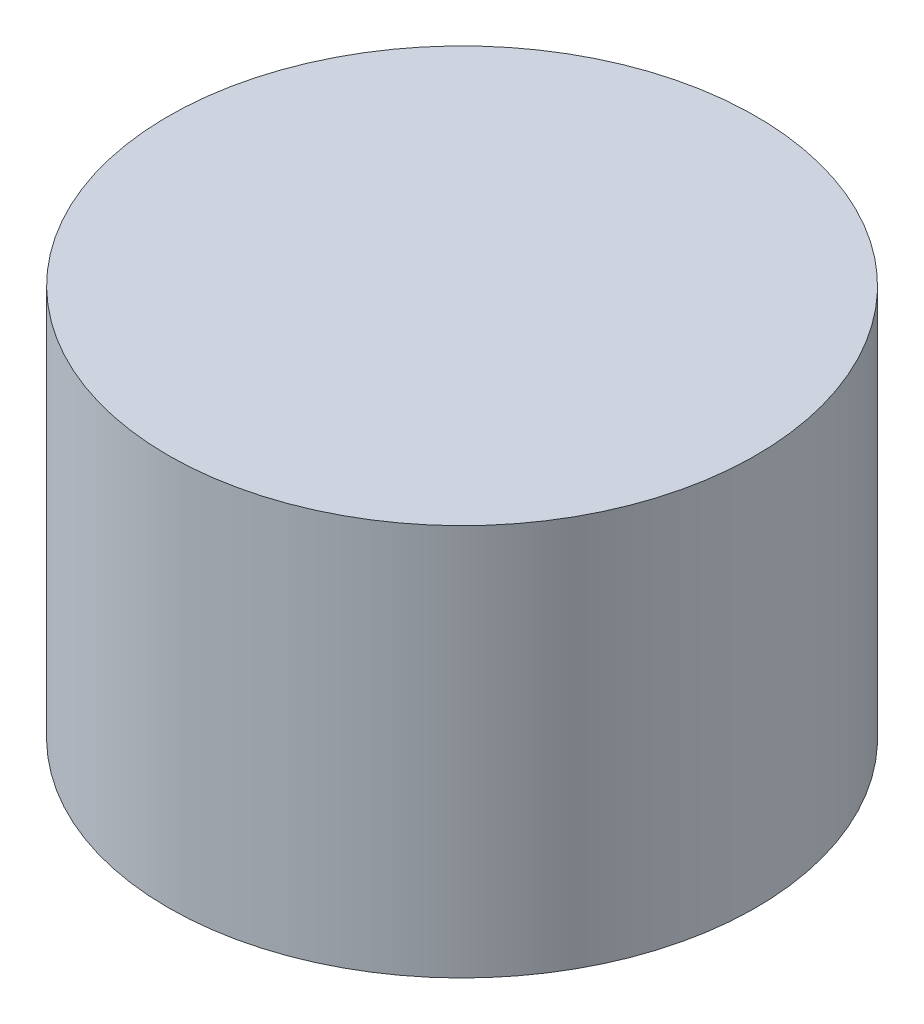
ISO-10303-21;
HEADER;
FILE_DESCRIPTION(('STEP AP214'),'2;1');
FILE_NAME('part.step','',(''),(''),'','','');
FILE_SCHEMA(('AUTOMOTIVE_DESIGN { 1 0 10303 214 1 1 1 1 }'));
ENDSEC;
DATA;
#1=APPLICATION_CONTEXT('core data for automotive mechanical design processes');
#2=APPLICATION_PROTOCOL_DEFINITION('international standard','automotive_design',2000,#1);
#3=PRODUCT_CONTEXT('',#1,'mechanical');
#4=PRODUCT('Part','Part','',(#3));
#5=PRODUCT_RELATED_PRODUCT_CATEGORY('part','',(#4));
#6=PRODUCT_DEFINITION_FORMATION('','',#4);
#7=PRODUCT_DEFINITION_CONTEXT('part definition',#1,'design');
#8=PRODUCT_DEFINITION('design','',#6,#7);
#9=PRODUCT_DEFINITION_SHAPE('','',#8);
#10=(LENGTH_UNIT() NAMED_UNIT(*) SI_UNIT(.MILLI.,.METRE.));
#11=(NAMED_UNIT(*) PLANE_ANGLE_UNIT() SI_UNIT($,.RADIAN.));
#12=(NAMED_UNIT(*) SI_UNIT($,.STERADIAN.) SOLID_ANGLE_UNIT());
#13=UNCERTAINTY_MEASURE_WITH_UNIT(LENGTH_MEASURE(1.E-05),#10,'distance_accuracy_value','');
#14=(GEOMETRIC_REPRESENTATION_CONTEXT(3) GLOBAL_UNCERTAINTY_ASSIGNED_CONTEXT((#13)) GLOBAL_UNIT_ASSIGNED_CONTEXT((#10,
#11,#12)) REPRESENTATION_CONTEXT('',''));
#15=CARTESIAN_POINT('',(0.,0.,0.));
#16=DIRECTION('',(0.,0.,1.));
#17=DIRECTION('',(1.,0.,0.));
#18=AXIS2_PLACEMENT_3D('',#15,#16,#17);
#19=CARTESIAN_POINT('',(0.,32.,0.));
#20=DIRECTION('',(0.,-1.,0.));
#21=DIRECTION('',(0.,0.,-1.));
#22=AXIS2_PLACEMENT_3D('',#19,#20,#21);
#23=CYLINDRICAL_SURFACE('',#22,24.);
#24=CARTESIAN_POINT('',(0.,32.,0.));
#25=DIRECTION('',(0.,1.,0.));
#26=DIRECTION('',(0.,0.,1.));
#27=AXIS2_PLACEMENT_3D('',#24,#25,#26);
#28=CIRCLE('',#27,24.);
#29=CARTESIAN_POINT('',(0.,32.,24.));
#30=VERTEX_POINT('',#29);
#31=EDGE_CURVE('E10',#30,#30,#28,.T.);
#32=ORIENTED_EDGE('',*,*,#31,.F.);
#33=EDGE_LOOP('',(#32));
#34=FACE_BOUND('',#33,.T.);
#35=CARTESIAN_POINT('',(0.,0.,0.));
#36=DIRECTION('',(0.,1.,0.));
#37=DIRECTION('',(0.,0.,1.));
#38=AXIS2_PLACEMENT_3D('',#35,#36,#37);
#39=CIRCLE('',#38,24.);
#40=CARTESIAN_POINT('',(0.,0.,24.));
#41=VERTEX_POINT('',#40);
#42=EDGE_CURVE('E51',#41,#41,#39,.T.);
#43=ORIENTED_EDGE('',*,*,#42,.T.);
#44=EDGE_LOOP('',(#43));
#45=FACE_BOUND('',#44,.T.);
#46=ADVANCED_FACE('F47',(#34,#45),#23,.T.);
#47=CARTESIAN_POINT('',(0.,32.,0.));
#48=DIRECTION('',(0.,1.,0.));
#49=DIRECTION('',(0.,0.,1.));
#50=AXIS2_PLACEMENT_3D('',#47,#48,#49);
#51=PLANE('',#50);
#52=ORIENTED_EDGE('',*,*,#31,.T.);
#53=EDGE_LOOP('',(#52));
#54=FACE_BOUND('',#53,.T.);
#55=ADVANCED_FACE('F63',(#54),#51,.T.);
#56=CARTESIAN_POINT('',(0.,0.,0.));
#57=DIRECTION('',(0.,1.,0.));
#58=DIRECTION('',(0.,0.,1.));
#59=AXIS2_PLACEMENT_3D('',#56,#57,#58);
#60=PLANE('',#59);
#61=ORIENTED_EDGE('',*,*,#42,.F.);
#62=EDGE_LOOP('',(#61));
#63=FACE_BOUND('',#62,.T.);
#64=ADVANCED_FACE('F61',(#63),#60,.F.);
#65=CLOSED_SHELL('',(#46,#55,#64));
#66=MANIFOLD_SOLID_BREP('B2',#65);
#67=ADVANCED_BREP_SHAPE_REPRESENTATION('',(#18,#66),#14);
#68=SHAPE_DEFINITION_REPRESENTATION(#9,#67);
ENDSEC;
END-ISO-10303-21;
